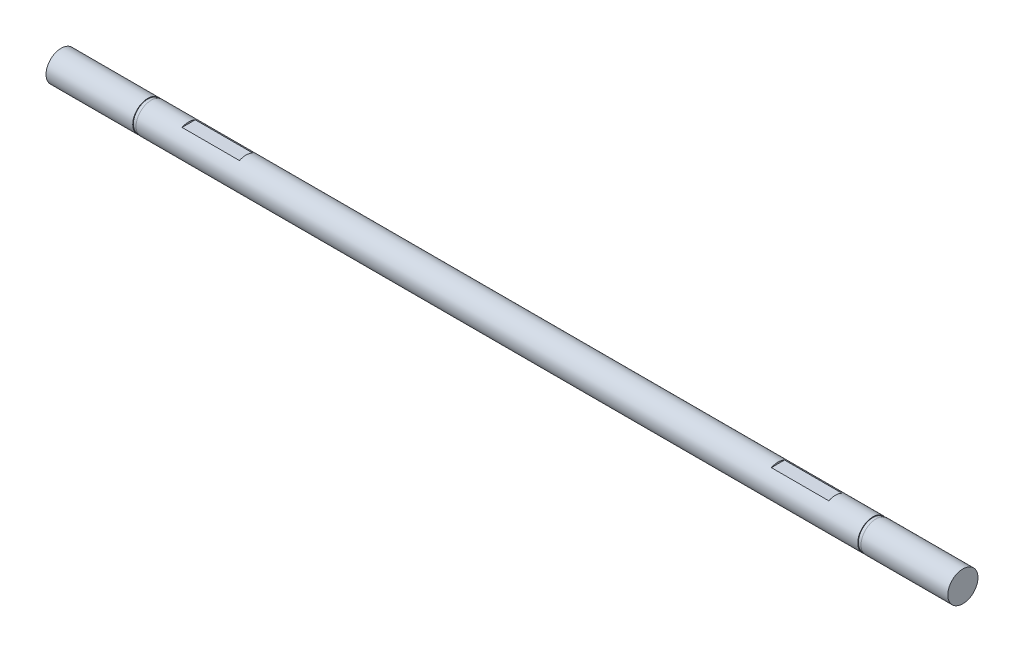
ISO-10303-21;
HEADER;
FILE_DESCRIPTION(('STEP AP214'),'2;1');
FILE_NAME('part.step','',(''),(''),'','','');
FILE_SCHEMA(('AUTOMOTIVE_DESIGN { 1 0 10303 214 1 1 1 1 }'));
ENDSEC;
DATA;
#1=APPLICATION_CONTEXT('core data for automotive mechanical design processes');
#2=APPLICATION_PROTOCOL_DEFINITION('international standard','automotive_design',2000,#1);
#3=PRODUCT_CONTEXT('',#1,'mechanical');
#4=PRODUCT('Part','Part','',(#3));
#5=PRODUCT_RELATED_PRODUCT_CATEGORY('part','',(#4));
#6=PRODUCT_DEFINITION_FORMATION('','',#4);
#7=PRODUCT_DEFINITION_CONTEXT('part definition',#1,'design');
#8=PRODUCT_DEFINITION('design','',#6,#7);
#9=PRODUCT_DEFINITION_SHAPE('','',#8);
#10=(LENGTH_UNIT() NAMED_UNIT(*) SI_UNIT(.MILLI.,.METRE.));
#11=(NAMED_UNIT(*) PLANE_ANGLE_UNIT() SI_UNIT($,.RADIAN.));
#12=(NAMED_UNIT(*) SI_UNIT($,.STERADIAN.) SOLID_ANGLE_UNIT());
#13=UNCERTAINTY_MEASURE_WITH_UNIT(LENGTH_MEASURE(1.E-05),#10,'distance_accuracy_value','');
#14=(GEOMETRIC_REPRESENTATION_CONTEXT(3) GLOBAL_UNCERTAINTY_ASSIGNED_CONTEXT((#13)) GLOBAL_UNIT_ASSIGNED_CONTEXT((#10,
#11,#12)) REPRESENTATION_CONTEXT('',''));
#15=CARTESIAN_POINT('',(0.,0.,0.));
#16=DIRECTION('',(0.,0.,1.));
#17=DIRECTION('',(1.,0.,0.));
#18=AXIS2_PLACEMENT_3D('',#15,#16,#17);
#19=CARTESIAN_POINT('',(19.,0.,0.));
#20=DIRECTION('',(-1.,0.,0.));
#21=DIRECTION('',(0.,0.,1.));
#22=AXIS2_PLACEMENT_3D('',#19,#20,#21);
#23=CYLINDRICAL_SURFACE('',#22,5.);
#24=CARTESIAN_POINT('',(-207.4,0.,0.));
#25=DIRECTION('',(1.,0.,0.));
#26=DIRECTION('',(0.,0.,-1.));
#27=AXIS2_PLACEMENT_3D('',#24,#25,#26);
#28=CIRCLE('',#27,5.);
#29=CARTESIAN_POINT('',(-207.4,0.,-5.));
#30=VERTEX_POINT('',#29);
#31=EDGE_CURVE('E378',#30,#30,#28,.T.);
#32=ORIENTED_EDGE('',*,*,#31,.T.);
#33=EDGE_LOOP('',(#32));
#34=FACE_BOUND('',#33,.T.);
#35=CARTESIAN_POINT('',(-176.,0.,0.));
#36=DIRECTION('',(-1.,0.,0.));
#37=DIRECTION('',(0.,0.,1.));
#38=AXIS2_PLACEMENT_3D('',#35,#36,#37);
#39=CIRCLE('',#38,5.);
#40=CARTESIAN_POINT('',(-176.,4.5,2.17944947177034));
#41=VERTEX_POINT('',#40);
#42=CARTESIAN_POINT('',(-176.,4.5,-2.17944947177034));
#43=VERTEX_POINT('',#42);
#44=EDGE_CURVE('E108',#41,#43,#39,.T.);
#45=ORIENTED_EDGE('',*,*,#44,.F.);
#46=DIRECTION('',(1.,0.,0.));
#47=VECTOR('',#46,1.);
#48=CARTESIAN_POINT('',(-195.,4.5,2.17944947177034));
#49=LINE('',#48,#47);
#50=CARTESIAN_POINT('',(-195.,4.5,2.17944947177034));
#51=VERTEX_POINT('',#50);
#52=EDGE_CURVE('E52',#51,#41,#49,.T.);
#53=ORIENTED_EDGE('',*,*,#52,.F.);
#54=CARTESIAN_POINT('',(-195.,0.,0.));
#55=DIRECTION('',(1.,0.,0.));
#56=DIRECTION('',(0.,0.,-1.));
#57=AXIS2_PLACEMENT_3D('',#54,#55,#56);
#58=CIRCLE('',#57,5.);
#59=CARTESIAN_POINT('',(-195.,4.5,-2.17944947177034));
#60=VERTEX_POINT('',#59);
#61=EDGE_CURVE('E80',#60,#51,#58,.T.);
#62=ORIENTED_EDGE('',*,*,#61,.F.);
#63=DIRECTION('',(1.,0.,0.));
#64=VECTOR('',#63,1.);
#65=CARTESIAN_POINT('',(-195.,4.5,-2.17944947177034));
#66=LINE('',#65,#64);
#67=EDGE_CURVE('E82',#60,#43,#66,.T.);
#68=ORIENTED_EDGE('',*,*,#67,.T.);
#69=EDGE_LOOP('',(#45,#53,#62,#68));
#70=FACE_BOUND('',#69,.T.);
#71=DIRECTION('',(-1.,0.,0.));
#72=VECTOR('',#71,1.);
#73=CARTESIAN_POINT('',(19.,4.5,2.17944947177034));
#74=LINE('',#73,#72);
#75=CARTESIAN_POINT('',(19.,4.5,2.17944947177034));
#76=VERTEX_POINT('',#75);
#77=CARTESIAN_POINT('',(0.,4.5,2.17944947177034));
#78=VERTEX_POINT('',#77);
#79=EDGE_CURVE('E44',#76,#78,#74,.T.);
#80=ORIENTED_EDGE('',*,*,#79,.T.);
#81=CARTESIAN_POINT('',(0.,0.,0.));
#82=DIRECTION('',(-1.,0.,0.));
#83=DIRECTION('',(0.,0.,1.));
#84=AXIS2_PLACEMENT_3D('',#81,#82,#83);
#85=CIRCLE('',#84,5.);
#86=CARTESIAN_POINT('',(0.,4.5,-2.17944947177034));
#87=VERTEX_POINT('',#86);
#88=EDGE_CURVE('E92',#78,#87,#85,.T.);
#89=ORIENTED_EDGE('',*,*,#88,.T.);
#90=DIRECTION('',(-1.,0.,0.));
#91=VECTOR('',#90,1.);
#92=CARTESIAN_POINT('',(19.,4.5,-2.17944947177034));
#93=LINE('',#92,#91);
#94=CARTESIAN_POINT('',(19.,4.5,-2.17944947177034));
#95=VERTEX_POINT('',#94);
#96=EDGE_CURVE('E11',#95,#87,#93,.T.);
#97=ORIENTED_EDGE('',*,*,#96,.F.);
#98=CARTESIAN_POINT('',(19.,0.,0.));
#99=DIRECTION('',(1.,0.,0.));
#100=DIRECTION('',(0.,0.,-1.));
#101=AXIS2_PLACEMENT_3D('',#98,#99,#100);
#102=CIRCLE('',#101,5.);
#103=EDGE_CURVE('E123',#95,#76,#102,.T.);
#104=ORIENTED_EDGE('',*,*,#103,.T.);
#105=EDGE_LOOP('',(#80,#89,#97,#104));
#106=FACE_BOUND('',#105,.T.);
#107=CARTESIAN_POINT('',(31.4,0.,0.));
#108=DIRECTION('',(1.,0.,0.));
#109=DIRECTION('',(0.,0.,-1.));
#110=AXIS2_PLACEMENT_3D('',#107,#108,#109);
#111=CIRCLE('',#110,5.);
#112=CARTESIAN_POINT('',(31.4,0.,-5.));
#113=VERTEX_POINT('',#112);
#114=EDGE_CURVE('E111',#113,#113,#111,.T.);
#115=ORIENTED_EDGE('',*,*,#114,.F.);
#116=EDGE_LOOP('',(#115));
#117=FACE_BOUND('',#116,.T.);
#118=ADVANCED_FACE('F34',(#34,#70,#106,#117),#23,.T.);
#119=CARTESIAN_POINT('',(-176.,0.,0.));
#120=DIRECTION('',(-1.,0.,0.));
#121=DIRECTION('',(0.,0.,1.));
#122=AXIS2_PLACEMENT_3D('',#119,#120,#121);
#123=PLANE('',#122);
#124=ORIENTED_EDGE('',*,*,#44,.T.);
#125=DIRECTION('',(0.,0.,1.));
#126=VECTOR('',#125,1.);
#127=CARTESIAN_POINT('',(-176.,4.5,2.17944947177034));
#128=LINE('',#127,#126);
#129=EDGE_CURVE('E83',#43,#41,#128,.T.);
#130=ORIENTED_EDGE('',*,*,#129,.T.);
#131=EDGE_LOOP('',(#124,#130));
#132=FACE_BOUND('',#131,.T.);
#133=ADVANCED_FACE('F141',(#132),#123,.T.);
#134=CARTESIAN_POINT('',(19.,4.5,2.17944947177034));
#135=DIRECTION('',(0.,-1.,0.));
#136=DIRECTION('',(0.,0.,-1.));
#137=AXIS2_PLACEMENT_3D('',#134,#135,#136);
#138=PLANE('',#137);
#139=DIRECTION('',(0.,0.,1.));
#140=VECTOR('',#139,1.);
#141=CARTESIAN_POINT('',(0.,4.5,2.17944947177034));
#142=LINE('',#141,#140);
#143=EDGE_CURVE('E126',#87,#78,#142,.T.);
#144=ORIENTED_EDGE('',*,*,#143,.T.);
#145=ORIENTED_EDGE('',*,*,#79,.F.);
#146=DIRECTION('',(0.,0.,1.));
#147=VECTOR('',#146,1.);
#148=CARTESIAN_POINT('',(19.,4.5,2.17944947177034));
#149=LINE('',#148,#147);
#150=EDGE_CURVE('E60',#95,#76,#149,.T.);
#151=ORIENTED_EDGE('',*,*,#150,.F.);
#152=ORIENTED_EDGE('',*,*,#96,.T.);
#153=EDGE_LOOP('',(#144,#145,#151,#152));
#154=FACE_BOUND('',#153,.T.);
#155=ADVANCED_FACE('F143',(#154),#138,.F.);
#156=CARTESIAN_POINT('',(19.,0.,0.));
#157=DIRECTION('',(1.,0.,0.));
#158=DIRECTION('',(0.,0.,-1.));
#159=AXIS2_PLACEMENT_3D('',#156,#157,#158);
#160=PLANE('',#159);
#161=ORIENTED_EDGE('',*,*,#103,.F.);
#162=ORIENTED_EDGE('',*,*,#150,.T.);
#163=EDGE_LOOP('',(#161,#162));
#164=FACE_BOUND('',#163,.T.);
#165=ADVANCED_FACE('F149',(#164),#160,.F.);
#166=CARTESIAN_POINT('',(31.4,0.,-5.));
#167=DIRECTION('',(-1.,0.,0.));
#168=DIRECTION('',(0.,0.,1.));
#169=AXIS2_PLACEMENT_3D('',#166,#167,#168);
#170=PLANE('',#169);
#171=CARTESIAN_POINT('',(31.4,0.,0.));
#172=DIRECTION('',(1.,0.,0.));
#173=DIRECTION('',(0.,0.,-1.));
#174=AXIS2_PLACEMENT_3D('',#171,#172,#173);
#175=CIRCLE('',#174,4.8);
#176=CARTESIAN_POINT('',(31.4,0.,-4.8));
#177=VERTEX_POINT('',#176);
#178=EDGE_CURVE('E120',#177,#177,#175,.T.);
#179=ORIENTED_EDGE('',*,*,#178,.F.);
#180=EDGE_LOOP('',(#179));
#181=FACE_BOUND('',#180,.T.);
#182=ORIENTED_EDGE('',*,*,#114,.T.);
#183=EDGE_LOOP('',(#182));
#184=FACE_BOUND('',#183,.T.);
#185=ADVANCED_FACE('F166',(#181,#184),#170,.F.);
#186=CARTESIAN_POINT('',(19.,0.,0.));
#187=DIRECTION('',(1.,0.,0.));
#188=DIRECTION('',(0.,0.,-1.));
#189=AXIS2_PLACEMENT_3D('',#186,#187,#188);
#190=CYLINDRICAL_SURFACE('',#189,4.8);
#191=CARTESIAN_POINT('',(32.5,0.,0.));
#192=DIRECTION('',(1.,0.,0.));
#193=DIRECTION('',(0.,0.,-1.));
#194=AXIS2_PLACEMENT_3D('',#191,#192,#193);
#195=CIRCLE('',#194,4.8);
#196=CARTESIAN_POINT('',(32.5,0.,-4.8));
#197=VERTEX_POINT('',#196);
#198=EDGE_CURVE('E117',#197,#197,#195,.T.);
#199=ORIENTED_EDGE('',*,*,#198,.F.);
#200=EDGE_LOOP('',(#199));
#201=FACE_BOUND('',#200,.T.);
#202=ORIENTED_EDGE('',*,*,#178,.T.);
#203=EDGE_LOOP('',(#202));
#204=FACE_BOUND('',#203,.T.);
#205=ADVANCED_FACE('F162',(#201,#204),#190,.T.);
#206=CARTESIAN_POINT('',(32.5,0.,-5.));
#207=DIRECTION('',(1.,0.,0.));
#208=DIRECTION('',(0.,0.,-1.));
#209=AXIS2_PLACEMENT_3D('',#206,#207,#208);
#210=PLANE('',#209);
#211=CARTESIAN_POINT('',(32.5,0.,0.));
#212=DIRECTION('',(1.,0.,0.));
#213=DIRECTION('',(0.,0.,-1.));
#214=AXIS2_PLACEMENT_3D('',#211,#212,#213);
#215=CIRCLE('',#214,5.);
#216=CARTESIAN_POINT('',(32.5,0.,-5.));
#217=VERTEX_POINT('',#216);
#218=EDGE_CURVE('E114',#217,#217,#215,.T.);
#219=ORIENTED_EDGE('',*,*,#218,.F.);
#220=EDGE_LOOP('',(#219));
#221=FACE_BOUND('',#220,.T.);
#222=ORIENTED_EDGE('',*,*,#198,.T.);
#223=EDGE_LOOP('',(#222));
#224=FACE_BOUND('',#223,.T.);
#225=ADVANCED_FACE('F159',(#221,#224),#210,.F.);
#226=ORIENTED_EDGE('',*,*,#218,.T.);
#227=EDGE_LOOP('',(#226));
#228=FACE_BOUND('',#227,.T.);
#229=CARTESIAN_POINT('',(61.2,0.,0.));
#230=DIRECTION('',(1.,0.,0.));
#231=DIRECTION('',(0.,0.,-1.));
#232=AXIS2_PLACEMENT_3D('',#229,#230,#231);
#233=CIRCLE('',#232,5.);
#234=CARTESIAN_POINT('',(61.2,0.,-5.));
#235=VERTEX_POINT('',#234);
#236=EDGE_CURVE('E375',#235,#235,#233,.T.);
#237=ORIENTED_EDGE('',*,*,#236,.F.);
#238=EDGE_LOOP('',(#237));
#239=FACE_BOUND('',#238,.T.);
#240=ADVANCED_FACE('F36',(#228,#239),#23,.T.);
#241=CARTESIAN_POINT('',(0.,0.,0.));
#242=DIRECTION('',(-1.,0.,0.));
#243=DIRECTION('',(0.,0.,1.));
#244=AXIS2_PLACEMENT_3D('',#241,#242,#243);
#245=PLANE('',#244);
#246=ORIENTED_EDGE('',*,*,#143,.F.);
#247=ORIENTED_EDGE('',*,*,#88,.F.);
#248=EDGE_LOOP('',(#246,#247));
#249=FACE_BOUND('',#248,.T.);
#250=ADVANCED_FACE('F155',(#249),#245,.F.);
#251=CARTESIAN_POINT('',(-195.,4.5,2.17944947177034));
#252=DIRECTION('',(0.,1.,0.));
#253=DIRECTION('',(0.,0.,1.));
#254=AXIS2_PLACEMENT_3D('',#251,#252,#253);
#255=PLANE('',#254);
#256=ORIENTED_EDGE('',*,*,#129,.F.);
#257=ORIENTED_EDGE('',*,*,#67,.F.);
#258=DIRECTION('',(0.,0.,1.));
#259=VECTOR('',#258,1.);
#260=CARTESIAN_POINT('',(-195.,4.5,2.17944947177034));
#261=LINE('',#260,#259);
#262=EDGE_CURVE('E38',#60,#51,#261,.T.);
#263=ORIENTED_EDGE('',*,*,#262,.T.);
#264=ORIENTED_EDGE('',*,*,#52,.T.);
#265=EDGE_LOOP('',(#256,#257,#263,#264));
#266=FACE_BOUND('',#265,.T.);
#267=ADVANCED_FACE('F89',(#266),#255,.T.);
#268=CARTESIAN_POINT('',(-195.,0.,0.));
#269=DIRECTION('',(-1.,0.,0.));
#270=DIRECTION('',(0.,0.,-1.));
#271=AXIS2_PLACEMENT_3D('',#268,#269,#270);
#272=PLANE('',#271);
#273=ORIENTED_EDGE('',*,*,#262,.F.);
#274=ORIENTED_EDGE('',*,*,#61,.T.);
#275=EDGE_LOOP('',(#273,#274));
#276=FACE_BOUND('',#275,.T.);
#277=ADVANCED_FACE('F79',(#276),#272,.F.);
#278=CARTESIAN_POINT('',(-207.4,0.,-5.));
#279=DIRECTION('',(1.,0.,0.));
#280=DIRECTION('',(0.,0.,1.));
#281=AXIS2_PLACEMENT_3D('',#278,#279,#280);
#282=PLANE('',#281);
#283=CARTESIAN_POINT('',(-207.4,0.,0.));
#284=DIRECTION('',(1.,0.,0.));
#285=DIRECTION('',(0.,0.,-1.));
#286=AXIS2_PLACEMENT_3D('',#283,#284,#285);
#287=CIRCLE('',#286,4.8);
#288=CARTESIAN_POINT('',(-207.4,0.,-4.8));
#289=VERTEX_POINT('',#288);
#290=EDGE_CURVE('E87',#289,#289,#287,.T.);
#291=ORIENTED_EDGE('',*,*,#290,.T.);
#292=EDGE_LOOP('',(#291));
#293=FACE_BOUND('',#292,.T.);
#294=ORIENTED_EDGE('',*,*,#31,.F.);
#295=EDGE_LOOP('',(#294));
#296=FACE_BOUND('',#295,.T.);
#297=ADVANCED_FACE('F215',(#293,#296),#282,.F.);
#298=CARTESIAN_POINT('',(-211.2,0.,0.));
#299=DIRECTION('',(-1.,0.,0.));
#300=DIRECTION('',(0.,0.,-1.));
#301=AXIS2_PLACEMENT_3D('',#298,#299,#300);
#302=CYLINDRICAL_SURFACE('',#301,4.8);
#303=CARTESIAN_POINT('',(-208.5,0.,0.));
#304=DIRECTION('',(1.,0.,0.));
#305=DIRECTION('',(0.,0.,-1.));
#306=AXIS2_PLACEMENT_3D('',#303,#304,#305);
#307=CIRCLE('',#306,4.8);
#308=CARTESIAN_POINT('',(-208.5,0.,-4.8));
#309=VERTEX_POINT('',#308);
#310=EDGE_CURVE('E386',#309,#309,#307,.T.);
#311=ORIENTED_EDGE('',*,*,#310,.T.);
#312=EDGE_LOOP('',(#311));
#313=FACE_BOUND('',#312,.T.);
#314=ORIENTED_EDGE('',*,*,#290,.F.);
#315=EDGE_LOOP('',(#314));
#316=FACE_BOUND('',#315,.T.);
#317=ADVANCED_FACE('F221',(#313,#316),#302,.T.);
#318=CARTESIAN_POINT('',(-208.5,0.,-5.));
#319=DIRECTION('',(-1.,0.,0.));
#320=DIRECTION('',(0.,0.,-1.));
#321=AXIS2_PLACEMENT_3D('',#318,#319,#320);
#322=PLANE('',#321);
#323=CARTESIAN_POINT('',(-208.5,0.,0.));
#324=DIRECTION('',(1.,0.,0.));
#325=DIRECTION('',(0.,0.,-1.));
#326=AXIS2_PLACEMENT_3D('',#323,#324,#325);
#327=CIRCLE('',#326,5.);
#328=CARTESIAN_POINT('',(-208.5,0.,-5.));
#329=VERTEX_POINT('',#328);
#330=EDGE_CURVE('E383',#329,#329,#327,.T.);
#331=ORIENTED_EDGE('',*,*,#330,.T.);
#332=EDGE_LOOP('',(#331));
#333=FACE_BOUND('',#332,.T.);
#334=ORIENTED_EDGE('',*,*,#310,.F.);
#335=EDGE_LOOP('',(#334));
#336=FACE_BOUND('',#335,.T.);
#337=ADVANCED_FACE('F229',(#333,#336),#322,.F.);
#338=ORIENTED_EDGE('',*,*,#330,.F.);
#339=EDGE_LOOP('',(#338));
#340=FACE_BOUND('',#339,.T.);
#341=CARTESIAN_POINT('',(-237.2,0.,0.));
#342=DIRECTION('',(-1.,0.,0.));
#343=DIRECTION('',(0.,0.,1.));
#344=AXIS2_PLACEMENT_3D('',#341,#342,#343);
#345=CIRCLE('',#344,5.);
#346=CARTESIAN_POINT('',(-237.2,0.,5.));
#347=VERTEX_POINT('',#346);
#348=EDGE_CURVE('E373',#347,#347,#345,.T.);
#349=ORIENTED_EDGE('',*,*,#348,.F.);
#350=EDGE_LOOP('',(#349));
#351=FACE_BOUND('',#350,.T.);
#352=ADVANCED_FACE('F151',(#340,#351),#23,.T.);
#353=CARTESIAN_POINT('',(61.2,0.,0.));
#354=DIRECTION('',(1.,0.,0.));
#355=DIRECTION('',(0.,0.,-1.));
#356=AXIS2_PLACEMENT_3D('',#353,#354,#355);
#357=PLANE('',#356);
#358=ORIENTED_EDGE('',*,*,#236,.T.);
#359=EDGE_LOOP('',(#358));
#360=FACE_BOUND('',#359,.T.);
#361=ADVANCED_FACE('F244',(#360),#357,.T.);
#362=CARTESIAN_POINT('',(-237.2,0.,0.));
#363=DIRECTION('',(-1.,0.,0.));
#364=DIRECTION('',(0.,0.,1.));
#365=AXIS2_PLACEMENT_3D('',#362,#363,#364);
#366=PLANE('',#365);
#367=ORIENTED_EDGE('',*,*,#348,.T.);
#368=EDGE_LOOP('',(#367));
#369=FACE_BOUND('',#368,.T.);
#370=ADVANCED_FACE('F251',(#369),#366,.T.);
#371=CLOSED_SHELL('',(#118,#133,#155,#165,#185,#205,#225,#240,#250,#267,#277,#297,#317,#337,
#352,#361,#370));
#372=MANIFOLD_SOLID_BREP('B2',#371);
#373=ADVANCED_BREP_SHAPE_REPRESENTATION('',(#18,#372),#14);
#374=SHAPE_DEFINITION_REPRESENTATION(#9,#373);
ENDSEC;
END-ISO-10303-21;
